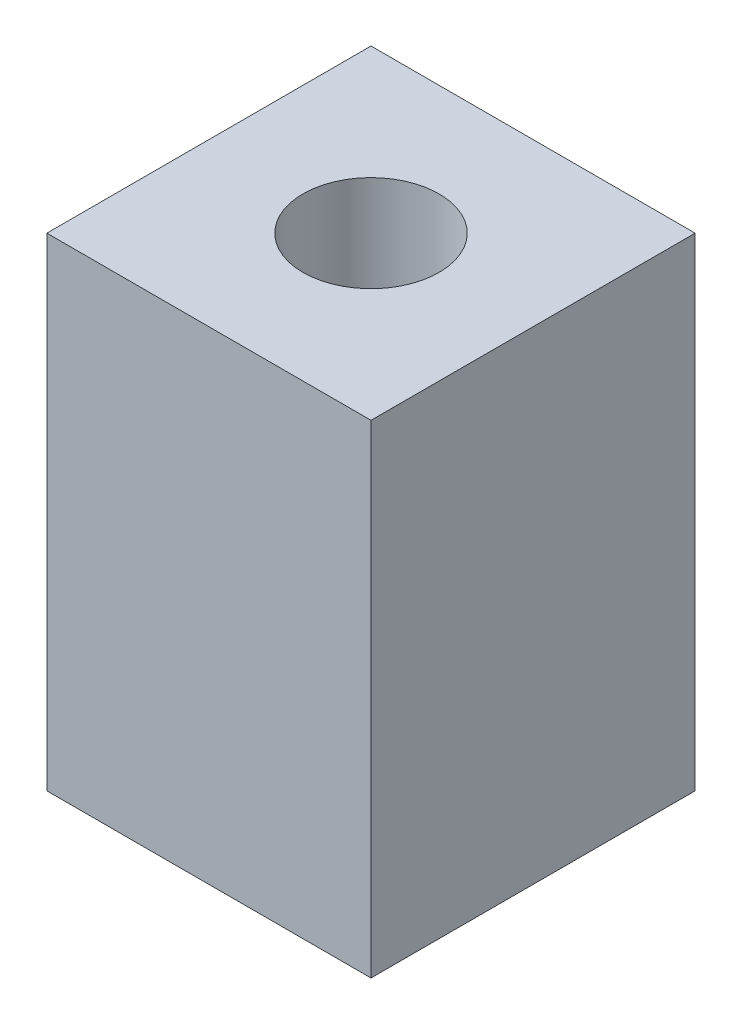
ISO-10303-21;
HEADER;
FILE_DESCRIPTION(('STEP AP214'),'2;1');
FILE_NAME('part.step','',(''),(''),'','','');
FILE_SCHEMA(('AUTOMOTIVE_DESIGN { 1 0 10303 214 1 1 1 1 }'));
ENDSEC;
DATA;
#1=APPLICATION_CONTEXT('core data for automotive mechanical design processes');
#2=APPLICATION_PROTOCOL_DEFINITION('international standard','automotive_design',2000,#1);
#3=PRODUCT_CONTEXT('',#1,'mechanical');
#4=PRODUCT('Part','Part','',(#3));
#5=PRODUCT_RELATED_PRODUCT_CATEGORY('part','',(#4));
#6=PRODUCT_DEFINITION_FORMATION('','',#4);
#7=PRODUCT_DEFINITION_CONTEXT('part definition',#1,'design');
#8=PRODUCT_DEFINITION('design','',#6,#7);
#9=PRODUCT_DEFINITION_SHAPE('','',#8);
#10=(LENGTH_UNIT() NAMED_UNIT(*) SI_UNIT(.MILLI.,.METRE.));
#11=(NAMED_UNIT(*) PLANE_ANGLE_UNIT() SI_UNIT($,.RADIAN.));
#12=(NAMED_UNIT(*) SI_UNIT($,.STERADIAN.) SOLID_ANGLE_UNIT());
#13=UNCERTAINTY_MEASURE_WITH_UNIT(LENGTH_MEASURE(1.E-05),#10,'distance_accuracy_value','');
#14=(GEOMETRIC_REPRESENTATION_CONTEXT(3) GLOBAL_UNCERTAINTY_ASSIGNED_CONTEXT((#13)) GLOBAL_UNIT_ASSIGNED_CONTEXT((#10,
#11,#12)) REPRESENTATION_CONTEXT('',''));
#15=CARTESIAN_POINT('',(0.,0.,0.));
#16=DIRECTION('',(0.,0.,1.));
#17=DIRECTION('',(1.,0.,0.));
#18=AXIS2_PLACEMENT_3D('',#15,#16,#17);
#19=CARTESIAN_POINT('',(0.,14.9,0.));
#20=DIRECTION('',(0.,-1.,0.));
#21=DIRECTION('',(0.,0.,-1.));
#22=AXIS2_PLACEMENT_3D('',#19,#20,#21);
#23=PLANE('',#22);
#24=DIRECTION('',(0.,0.,-1.));
#25=VECTOR('',#24,1.);
#26=CARTESIAN_POINT('',(5.,14.9,-5.));
#27=LINE('',#26,#25);
#28=CARTESIAN_POINT('',(5.,14.9,5.));
#29=VERTEX_POINT('',#28);
#30=CARTESIAN_POINT('',(5.,14.9,-5.));
#31=VERTEX_POINT('',#30);
#32=EDGE_CURVE('E87',#29,#31,#27,.T.);
#33=ORIENTED_EDGE('',*,*,#32,.T.);
#34=DIRECTION('',(-1.,0.,0.));
#35=VECTOR('',#34,1.);
#36=CARTESIAN_POINT('',(-5.,14.9,-5.));
#37=LINE('',#36,#35);
#38=CARTESIAN_POINT('',(-5.,14.9,-5.));
#39=VERTEX_POINT('',#38);
#40=EDGE_CURVE('E82',#31,#39,#37,.T.);
#41=ORIENTED_EDGE('',*,*,#40,.T.);
#42=DIRECTION('',(0.,0.,1.));
#43=VECTOR('',#42,1.);
#44=CARTESIAN_POINT('',(-5.,14.9,5.));
#45=LINE('',#44,#43);
#46=CARTESIAN_POINT('',(-5.,14.9,5.));
#47=VERTEX_POINT('',#46);
#48=EDGE_CURVE('E85',#39,#47,#45,.T.);
#49=ORIENTED_EDGE('',*,*,#48,.T.);
#50=DIRECTION('',(1.,0.,0.));
#51=VECTOR('',#50,1.);
#52=CARTESIAN_POINT('',(5.,14.9,5.));
#53=LINE('',#52,#51);
#54=EDGE_CURVE('E52',#47,#29,#53,.T.);
#55=ORIENTED_EDGE('',*,*,#54,.T.);
#56=EDGE_LOOP('',(#33,#41,#49,#55));
#57=FACE_BOUND('',#56,.T.);
#58=CARTESIAN_POINT('',(0.,14.9,0.));
#59=DIRECTION('',(0.,1.,0.));
#60=DIRECTION('',(0.,0.,1.));
#61=AXIS2_PLACEMENT_3D('',#58,#59,#60);
#62=CIRCLE('',#61,2.1);
#63=CARTESIAN_POINT('',(0.,14.9,2.1));
#64=VERTEX_POINT('',#63);
#65=EDGE_CURVE('E102',#64,#64,#62,.T.);
#66=ORIENTED_EDGE('',*,*,#65,.F.);
#67=EDGE_LOOP('',(#66));
#68=FACE_BOUND('',#67,.T.);
#69=ADVANCED_FACE('F35',(#57,#68),#23,.F.);
#70=CARTESIAN_POINT('',(0.,0.,0.));
#71=DIRECTION('',(0.,-1.,0.));
#72=DIRECTION('',(0.,0.,-1.));
#73=AXIS2_PLACEMENT_3D('',#70,#71,#72);
#74=PLANE('',#73);
#75=DIRECTION('',(0.,0.,-1.));
#76=VECTOR('',#75,1.);
#77=CARTESIAN_POINT('',(5.,0.,-5.));
#78=LINE('',#77,#76);
#79=CARTESIAN_POINT('',(5.,0.,5.));
#80=VERTEX_POINT('',#79);
#81=CARTESIAN_POINT('',(5.,0.,-5.));
#82=VERTEX_POINT('',#81);
#83=EDGE_CURVE('E99',#80,#82,#78,.T.);
#84=ORIENTED_EDGE('',*,*,#83,.F.);
#85=DIRECTION('',(1.,0.,0.));
#86=VECTOR('',#85,1.);
#87=CARTESIAN_POINT('',(5.,0.,5.));
#88=LINE('',#87,#86);
#89=CARTESIAN_POINT('',(-5.,0.,5.));
#90=VERTEX_POINT('',#89);
#91=EDGE_CURVE('E75',#90,#80,#88,.T.);
#92=ORIENTED_EDGE('',*,*,#91,.F.);
#93=DIRECTION('',(0.,0.,1.));
#94=VECTOR('',#93,1.);
#95=CARTESIAN_POINT('',(-5.,0.,5.));
#96=LINE('',#95,#94);
#97=CARTESIAN_POINT('',(-5.,0.,-5.));
#98=VERTEX_POINT('',#97);
#99=EDGE_CURVE('E69',#98,#90,#96,.T.);
#100=ORIENTED_EDGE('',*,*,#99,.F.);
#101=DIRECTION('',(-1.,0.,0.));
#102=VECTOR('',#101,1.);
#103=CARTESIAN_POINT('',(-5.,0.,-5.));
#104=LINE('',#103,#102);
#105=EDGE_CURVE('E91',#82,#98,#104,.T.);
#106=ORIENTED_EDGE('',*,*,#105,.F.);
#107=EDGE_LOOP('',(#84,#92,#100,#106));
#108=FACE_BOUND('',#107,.T.);
#109=CARTESIAN_POINT('',(0.,0.,0.));
#110=DIRECTION('',(0.,1.,0.));
#111=DIRECTION('',(0.,0.,1.));
#112=AXIS2_PLACEMENT_3D('',#109,#110,#111);
#113=CIRCLE('',#112,2.1);
#114=CARTESIAN_POINT('',(0.,0.,2.1));
#115=VERTEX_POINT('',#114);
#116=EDGE_CURVE('E114',#115,#115,#113,.T.);
#117=ORIENTED_EDGE('',*,*,#116,.T.);
#118=EDGE_LOOP('',(#117));
#119=FACE_BOUND('',#118,.T.);
#120=ADVANCED_FACE('F110',(#108,#119),#74,.T.);
#121=CARTESIAN_POINT('',(5.,14.9,-5.));
#122=DIRECTION('',(-1.,0.,0.));
#123=DIRECTION('',(0.,0.,1.));
#124=AXIS2_PLACEMENT_3D('',#121,#122,#123);
#125=PLANE('',#124);
#126=ORIENTED_EDGE('',*,*,#83,.T.);
#127=DIRECTION('',(0.,-1.,0.));
#128=VECTOR('',#127,1.);
#129=CARTESIAN_POINT('',(5.,14.9,-5.));
#130=LINE('',#129,#128);
#131=EDGE_CURVE('E11',#31,#82,#130,.T.);
#132=ORIENTED_EDGE('',*,*,#131,.F.);
#133=ORIENTED_EDGE('',*,*,#32,.F.);
#134=DIRECTION('',(0.,-1.,0.));
#135=VECTOR('',#134,1.);
#136=CARTESIAN_POINT('',(5.,14.9,5.));
#137=LINE('',#136,#135);
#138=EDGE_CURVE('E95',#29,#80,#137,.T.);
#139=ORIENTED_EDGE('',*,*,#138,.T.);
#140=EDGE_LOOP('',(#126,#132,#133,#139));
#141=FACE_BOUND('',#140,.T.);
#142=ADVANCED_FACE('F37',(#141),#125,.F.);
#143=CARTESIAN_POINT('',(-5.,14.9,-5.));
#144=DIRECTION('',(0.,0.,1.));
#145=DIRECTION('',(1.,0.,0.));
#146=AXIS2_PLACEMENT_3D('',#143,#144,#145);
#147=PLANE('',#146);
#148=ORIENTED_EDGE('',*,*,#105,.T.);
#149=DIRECTION('',(0.,-1.,0.));
#150=VECTOR('',#149,1.);
#151=CARTESIAN_POINT('',(-5.,14.9,-5.));
#152=LINE('',#151,#150);
#153=EDGE_CURVE('E44',#39,#98,#152,.T.);
#154=ORIENTED_EDGE('',*,*,#153,.F.);
#155=ORIENTED_EDGE('',*,*,#40,.F.);
#156=ORIENTED_EDGE('',*,*,#131,.T.);
#157=EDGE_LOOP('',(#148,#154,#155,#156));
#158=FACE_BOUND('',#157,.T.);
#159=ADVANCED_FACE('F90',(#158),#147,.F.);
#160=CARTESIAN_POINT('',(-5.,14.9,5.));
#161=DIRECTION('',(1.,0.,0.));
#162=DIRECTION('',(0.,0.,-1.));
#163=AXIS2_PLACEMENT_3D('',#160,#161,#162);
#164=PLANE('',#163);
#165=ORIENTED_EDGE('',*,*,#99,.T.);
#166=DIRECTION('',(0.,-1.,0.));
#167=VECTOR('',#166,1.);
#168=CARTESIAN_POINT('',(-5.,14.9,5.));
#169=LINE('',#168,#167);
#170=EDGE_CURVE('E92',#47,#90,#169,.T.);
#171=ORIENTED_EDGE('',*,*,#170,.F.);
#172=ORIENTED_EDGE('',*,*,#48,.F.);
#173=ORIENTED_EDGE('',*,*,#153,.T.);
#174=EDGE_LOOP('',(#165,#171,#172,#173));
#175=FACE_BOUND('',#174,.T.);
#176=ADVANCED_FACE('F93',(#175),#164,.F.);
#177=CARTESIAN_POINT('',(5.,14.9,5.));
#178=DIRECTION('',(0.,0.,-1.));
#179=DIRECTION('',(-1.,0.,0.));
#180=AXIS2_PLACEMENT_3D('',#177,#178,#179);
#181=PLANE('',#180);
#182=ORIENTED_EDGE('',*,*,#91,.T.);
#183=ORIENTED_EDGE('',*,*,#138,.F.);
#184=ORIENTED_EDGE('',*,*,#54,.F.);
#185=ORIENTED_EDGE('',*,*,#170,.T.);
#186=EDGE_LOOP('',(#182,#183,#184,#185));
#187=FACE_BOUND('',#186,.T.);
#188=ADVANCED_FACE('F107',(#187),#181,.F.);
#189=CARTESIAN_POINT('',(0.,14.9,0.));
#190=DIRECTION('',(0.,-1.,0.));
#191=DIRECTION('',(0.,0.,-1.));
#192=AXIS2_PLACEMENT_3D('',#189,#190,#191);
#193=CYLINDRICAL_SURFACE('',#192,2.1);
#194=ORIENTED_EDGE('',*,*,#65,.T.);
#195=EDGE_LOOP('',(#194));
#196=FACE_BOUND('',#195,.T.);
#197=ORIENTED_EDGE('',*,*,#116,.F.);
#198=EDGE_LOOP('',(#197));
#199=FACE_BOUND('',#198,.T.);
#200=ADVANCED_FACE('F120',(#196,#199),#193,.F.);
#201=CLOSED_SHELL('',(#69,#120,#142,#159,#176,#188,#200));
#202=MANIFOLD_SOLID_BREP('B2',#201);
#203=ADVANCED_BREP_SHAPE_REPRESENTATION('',(#18,#202),#14);
#204=SHAPE_DEFINITION_REPRESENTATION(#9,#203);
ENDSEC;
END-ISO-10303-21;
